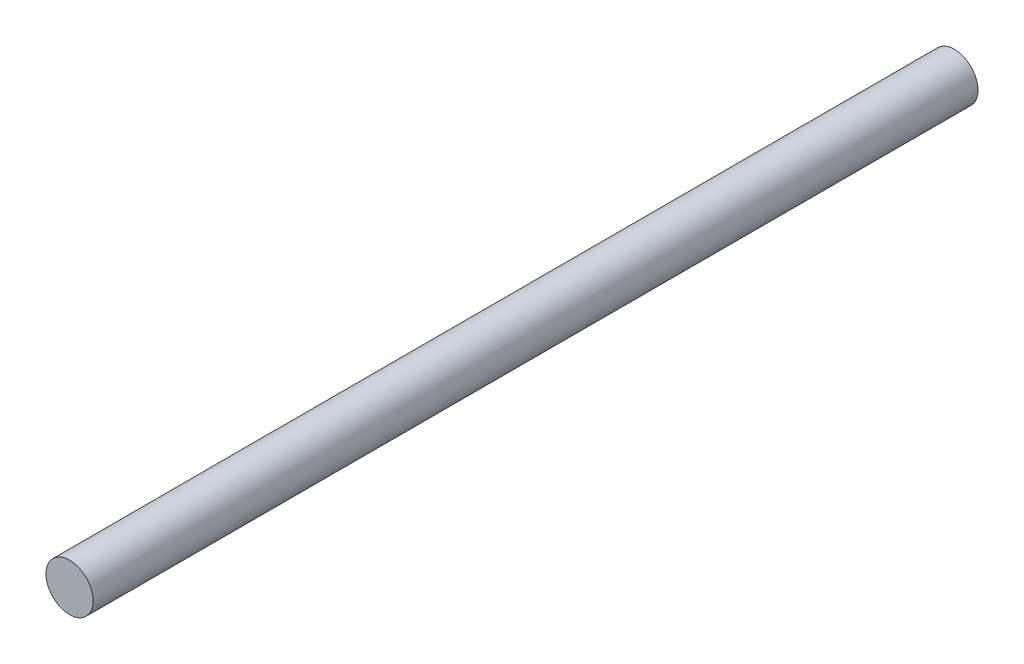
ISO-10303-21;
HEADER;
FILE_DESCRIPTION(('STEP AP214'),'2;1');
FILE_NAME('part.step','',(''),(''),'','','');
FILE_SCHEMA(('AUTOMOTIVE_DESIGN { 1 0 10303 214 1 1 1 1 }'));
ENDSEC;
DATA;
#1=APPLICATION_CONTEXT('core data for automotive mechanical design processes');
#2=APPLICATION_PROTOCOL_DEFINITION('international standard','automotive_design',2000,#1);
#3=PRODUCT_CONTEXT('',#1,'mechanical');
#4=PRODUCT('Part','Part','',(#3));
#5=PRODUCT_RELATED_PRODUCT_CATEGORY('part','',(#4));
#6=PRODUCT_DEFINITION_FORMATION('','',#4);
#7=PRODUCT_DEFINITION_CONTEXT('part definition',#1,'design');
#8=PRODUCT_DEFINITION('design','',#6,#7);
#9=PRODUCT_DEFINITION_SHAPE('','',#8);
#10=(LENGTH_UNIT() NAMED_UNIT(*) SI_UNIT(.MILLI.,.METRE.));
#11=(NAMED_UNIT(*) PLANE_ANGLE_UNIT() SI_UNIT($,.RADIAN.));
#12=(NAMED_UNIT(*) SI_UNIT($,.STERADIAN.) SOLID_ANGLE_UNIT());
#13=UNCERTAINTY_MEASURE_WITH_UNIT(LENGTH_MEASURE(1.E-05),#10,'distance_accuracy_value','');
#14=(GEOMETRIC_REPRESENTATION_CONTEXT(3) GLOBAL_UNCERTAINTY_ASSIGNED_CONTEXT((#13)) GLOBAL_UNIT_ASSIGNED_CONTEXT((#10,
#11,#12)) REPRESENTATION_CONTEXT('',''));
#15=CARTESIAN_POINT('',(0.,0.,0.));
#16=DIRECTION('',(0.,0.,1.));
#17=DIRECTION('',(1.,0.,0.));
#18=AXIS2_PLACEMENT_3D('',#15,#16,#17);
#19=CARTESIAN_POINT('',(0.,0.,150.));
#20=DIRECTION('',(0.,0.,-1.));
#21=DIRECTION('',(-1.,0.,0.));
#22=AXIS2_PLACEMENT_3D('',#19,#20,#21);
#23=CYLINDRICAL_SURFACE('',#22,4.);
#24=CARTESIAN_POINT('',(0.,0.,150.));
#25=DIRECTION('',(0.,0.,1.));
#26=DIRECTION('',(1.,0.,0.));
#27=AXIS2_PLACEMENT_3D('',#24,#25,#26);
#28=CIRCLE('',#27,4.);
#29=CARTESIAN_POINT('',(4.,0.,150.));
#30=VERTEX_POINT('',#29);
#31=EDGE_CURVE('E10',#30,#30,#28,.T.);
#32=ORIENTED_EDGE('',*,*,#31,.F.);
#33=EDGE_LOOP('',(#32));
#34=FACE_BOUND('',#33,.T.);
#35=CARTESIAN_POINT('',(0.,0.,0.));
#36=DIRECTION('',(0.,0.,1.));
#37=DIRECTION('',(1.,0.,0.));
#38=AXIS2_PLACEMENT_3D('',#35,#36,#37);
#39=CIRCLE('',#38,4.);
#40=CARTESIAN_POINT('',(4.,0.,0.));
#41=VERTEX_POINT('',#40);
#42=EDGE_CURVE('E34',#41,#41,#39,.T.);
#43=ORIENTED_EDGE('',*,*,#42,.T.);
#44=EDGE_LOOP('',(#43));
#45=FACE_BOUND('',#44,.T.);
#46=ADVANCED_FACE('F31',(#34,#45),#23,.T.);
#47=CARTESIAN_POINT('',(0.,0.,150.));
#48=DIRECTION('',(0.,0.,1.));
#49=DIRECTION('',(1.,0.,0.));
#50=AXIS2_PLACEMENT_3D('',#47,#48,#49);
#51=PLANE('',#50);
#52=ORIENTED_EDGE('',*,*,#31,.T.);
#53=EDGE_LOOP('',(#52));
#54=FACE_BOUND('',#53,.T.);
#55=ADVANCED_FACE('F46',(#54),#51,.T.);
#56=CARTESIAN_POINT('',(0.,0.,0.));
#57=DIRECTION('',(0.,0.,1.));
#58=DIRECTION('',(1.,0.,0.));
#59=AXIS2_PLACEMENT_3D('',#56,#57,#58);
#60=PLANE('',#59);
#61=ORIENTED_EDGE('',*,*,#42,.F.);
#62=EDGE_LOOP('',(#61));
#63=FACE_BOUND('',#62,.T.);
#64=ADVANCED_FACE('F44',(#63),#60,.F.);
#65=CLOSED_SHELL('',(#46,#55,#64));
#66=MANIFOLD_SOLID_BREP('B2',#65);
#67=ADVANCED_BREP_SHAPE_REPRESENTATION('',(#18,#66),#14);
#68=SHAPE_DEFINITION_REPRESENTATION(#9,#67);
ENDSEC;
END-ISO-10303-21;
